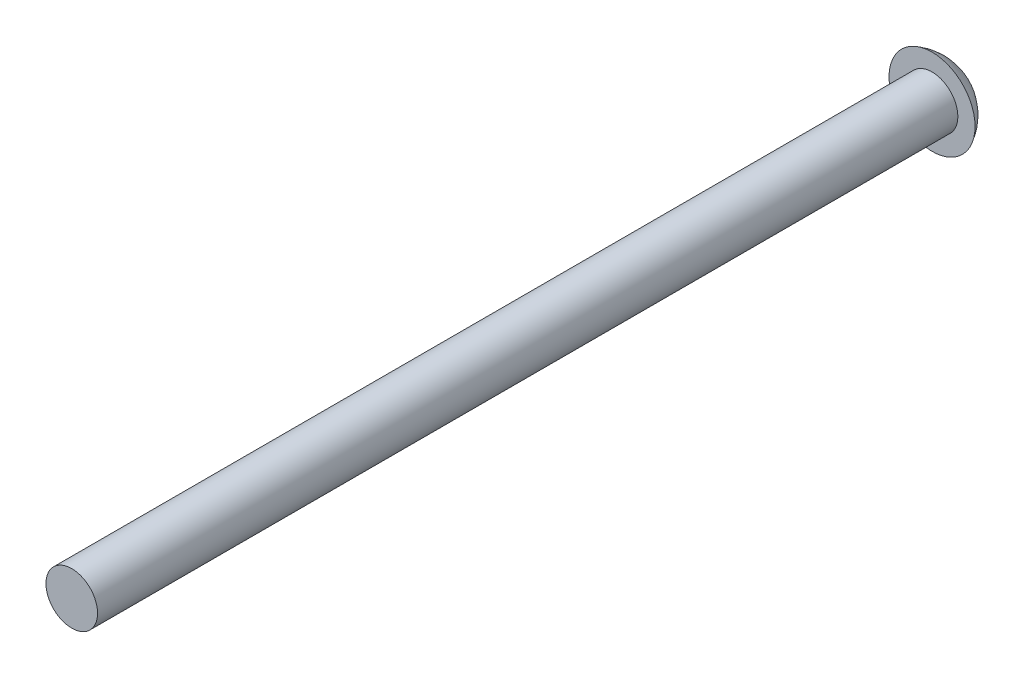
ISO-10303-21;
HEADER;
FILE_DESCRIPTION(('STEP AP214'),'2;1');
FILE_NAME('part.step','',(''),(''),'','','');
FILE_SCHEMA(('AUTOMOTIVE_DESIGN { 1 0 10303 214 1 1 1 1 }'));
ENDSEC;
DATA;
#1=APPLICATION_CONTEXT('core data for automotive mechanical design processes');
#2=APPLICATION_PROTOCOL_DEFINITION('international standard','automotive_design',2000,#1);
#3=PRODUCT_CONTEXT('',#1,'mechanical');
#4=PRODUCT('Part','Part','',(#3));
#5=PRODUCT_RELATED_PRODUCT_CATEGORY('part','',(#4));
#6=PRODUCT_DEFINITION_FORMATION('','',#4);
#7=PRODUCT_DEFINITION_CONTEXT('part definition',#1,'design');
#8=PRODUCT_DEFINITION('design','',#6,#7);
#9=PRODUCT_DEFINITION_SHAPE('','',#8);
#10=(LENGTH_UNIT() NAMED_UNIT(*) SI_UNIT(.MILLI.,.METRE.));
#11=(NAMED_UNIT(*) PLANE_ANGLE_UNIT() SI_UNIT($,.RADIAN.));
#12=(NAMED_UNIT(*) SI_UNIT($,.STERADIAN.) SOLID_ANGLE_UNIT());
#13=UNCERTAINTY_MEASURE_WITH_UNIT(LENGTH_MEASURE(1.E-05),#10,'distance_accuracy_value','');
#14=(GEOMETRIC_REPRESENTATION_CONTEXT(3) GLOBAL_UNCERTAINTY_ASSIGNED_CONTEXT((#13)) GLOBAL_UNIT_ASSIGNED_CONTEXT((#10,
#11,#12)) REPRESENTATION_CONTEXT('',''));
#15=CARTESIAN_POINT('',(0.,0.,0.));
#16=DIRECTION('',(0.,0.,1.));
#17=DIRECTION('',(1.,0.,0.));
#18=AXIS2_PLACEMENT_3D('',#15,#16,#17);
#19=CARTESIAN_POINT('',(0.,0.,100.));
#20=DIRECTION('',(0.,0.,-1.));
#21=DIRECTION('',(-1.,0.,0.));
#22=AXIS2_PLACEMENT_3D('',#19,#20,#21);
#23=CYLINDRICAL_SURFACE('',#22,3.);
#24=CARTESIAN_POINT('',(0.,0.,100.));
#25=DIRECTION('',(0.,0.,1.));
#26=DIRECTION('',(1.,0.,0.));
#27=AXIS2_PLACEMENT_3D('',#24,#25,#26);
#28=CIRCLE('',#27,3.);
#29=CARTESIAN_POINT('',(3.,0.,100.));
#30=VERTEX_POINT('',#29);
#31=EDGE_CURVE('E10',#30,#30,#28,.T.);
#32=ORIENTED_EDGE('',*,*,#31,.F.);
#33=EDGE_LOOP('',(#32));
#34=FACE_BOUND('',#33,.T.);
#35=CARTESIAN_POINT('',(0.,0.,0.));
#36=DIRECTION('',(0.,0.,1.));
#37=DIRECTION('',(1.,0.,0.));
#38=AXIS2_PLACEMENT_3D('',#35,#36,#37);
#39=CIRCLE('',#38,3.);
#40=CARTESIAN_POINT('',(3.,0.,0.));
#41=VERTEX_POINT('',#40);
#42=EDGE_CURVE('E39',#41,#41,#39,.T.);
#43=ORIENTED_EDGE('',*,*,#42,.T.);
#44=EDGE_LOOP('',(#43));
#45=FACE_BOUND('',#44,.T.);
#46=ADVANCED_FACE('F33',(#34,#45),#23,.T.);
#47=CARTESIAN_POINT('',(0.,0.,100.));
#48=DIRECTION('',(0.,0.,1.));
#49=DIRECTION('',(1.,0.,0.));
#50=AXIS2_PLACEMENT_3D('',#47,#48,#49);
#51=PLANE('',#50);
#52=ORIENTED_EDGE('',*,*,#31,.T.);
#53=EDGE_LOOP('',(#52));
#54=FACE_BOUND('',#53,.T.);
#55=ADVANCED_FACE('F54',(#54),#51,.T.);
#56=CARTESIAN_POINT('',(0.,0.,2.66666666666667));
#57=DIRECTION('',(0.,0.,1.));
#58=DIRECTION('',(1.,0.,0.));
#59=AXIS2_PLACEMENT_3D('',#56,#57,#58);
#60=SPHERICAL_SURFACE('',#59,5.66666666666667);
#61=CARTESIAN_POINT('',(0.,0.,0.));
#62=DIRECTION('',(0.,0.,1.));
#63=DIRECTION('',(1.,0.,0.));
#64=AXIS2_PLACEMENT_3D('',#61,#62,#63);
#65=CIRCLE('',#64,5.);
#66=CARTESIAN_POINT('',(5.,0.,0.));
#67=VERTEX_POINT('',#66);
#68=EDGE_CURVE('E43',#67,#67,#65,.T.);
#69=ORIENTED_EDGE('',*,*,#68,.F.);
#70=EDGE_LOOP('',(#69));
#71=FACE_BOUND('',#70,.T.);
#72=ADVANCED_FACE('F52',(#71),#60,.T.);
#73=CARTESIAN_POINT('',(0.,0.,0.));
#74=DIRECTION('',(0.,0.,1.));
#75=DIRECTION('',(1.,0.,0.));
#76=AXIS2_PLACEMENT_3D('',#73,#74,#75);
#77=PLANE('',#76);
#78=ORIENTED_EDGE('',*,*,#42,.F.);
#79=EDGE_LOOP('',(#78));
#80=FACE_BOUND('',#79,.T.);
#81=ORIENTED_EDGE('',*,*,#68,.T.);
#82=EDGE_LOOP('',(#81));
#83=FACE_BOUND('',#82,.T.);
#84=ADVANCED_FACE('F50',(#80,#83),#77,.T.);
#85=CLOSED_SHELL('',(#46,#55,#72,#84));
#86=MANIFOLD_SOLID_BREP('B2',#85);
#87=ADVANCED_BREP_SHAPE_REPRESENTATION('',(#18,#86),#14);
#88=SHAPE_DEFINITION_REPRESENTATION(#9,#87);
ENDSEC;
END-ISO-10303-21;
